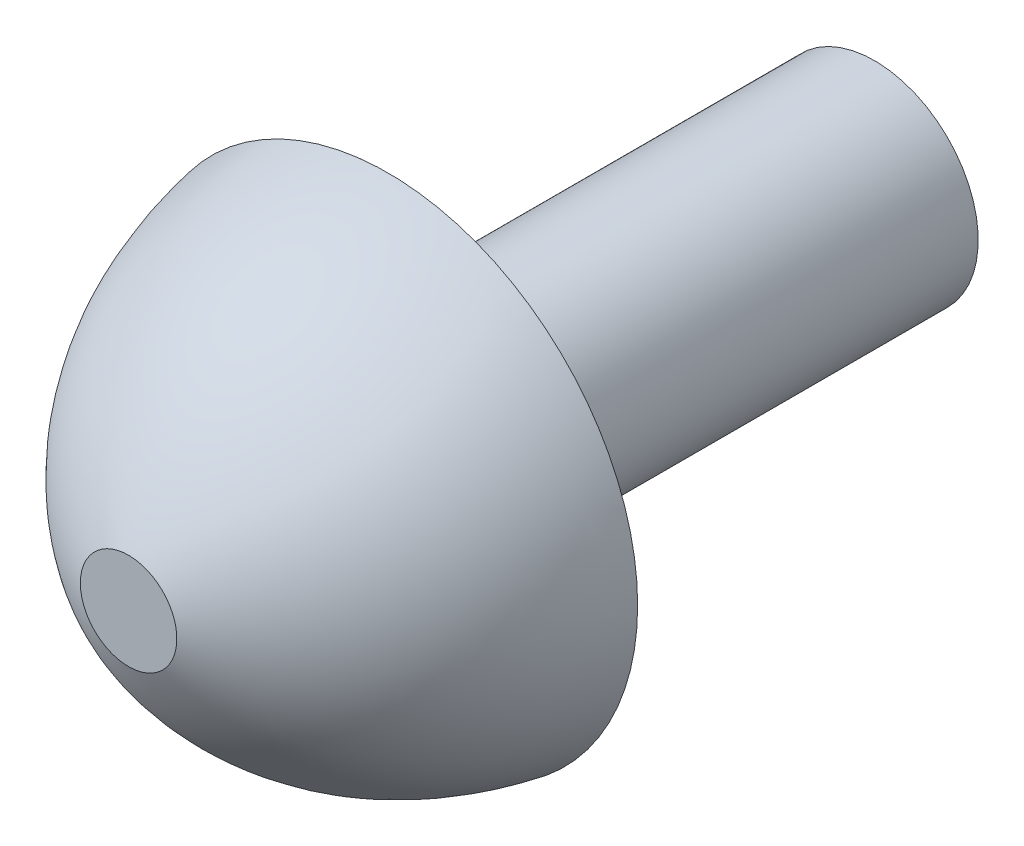
ISO-10303-21;
HEADER;
FILE_DESCRIPTION(('STEP AP214'),'2;1');
FILE_NAME('part.step','',(''),(''),'','','');
FILE_SCHEMA(('AUTOMOTIVE_DESIGN { 1 0 10303 214 1 1 1 1 }'));
ENDSEC;
DATA;
#1=APPLICATION_CONTEXT('core data for automotive mechanical design processes');
#2=APPLICATION_PROTOCOL_DEFINITION('international standard','automotive_design',2000,#1);
#3=PRODUCT_CONTEXT('',#1,'mechanical');
#4=PRODUCT('Part','Part','',(#3));
#5=PRODUCT_RELATED_PRODUCT_CATEGORY('part','',(#4));
#6=PRODUCT_DEFINITION_FORMATION('','',#4);
#7=PRODUCT_DEFINITION_CONTEXT('part definition',#1,'design');
#8=PRODUCT_DEFINITION('design','',#6,#7);
#9=PRODUCT_DEFINITION_SHAPE('','',#8);
#10=(LENGTH_UNIT() NAMED_UNIT(*) SI_UNIT(.MILLI.,.METRE.));
#11=(NAMED_UNIT(*) PLANE_ANGLE_UNIT() SI_UNIT($,.RADIAN.));
#12=(NAMED_UNIT(*) SI_UNIT($,.STERADIAN.) SOLID_ANGLE_UNIT());
#13=UNCERTAINTY_MEASURE_WITH_UNIT(LENGTH_MEASURE(1.E-05),#10,'distance_accuracy_value','');
#14=(GEOMETRIC_REPRESENTATION_CONTEXT(3) GLOBAL_UNCERTAINTY_ASSIGNED_CONTEXT((#13)) GLOBAL_UNIT_ASSIGNED_CONTEXT((#10,
#11,#12)) REPRESENTATION_CONTEXT('',''));
#15=CARTESIAN_POINT('',(0.,0.,0.));
#16=DIRECTION('',(0.,0.,1.));
#17=DIRECTION('',(1.,0.,0.));
#18=AXIS2_PLACEMENT_3D('',#15,#16,#17);
#19=CARTESIAN_POINT('',(0.,0.,-11.1962025316456));
#20=DIRECTION('',(0.,0.,-1.));
#21=DIRECTION('',(-1.,0.,0.));
#22=AXIS2_PLACEMENT_3D('',#19,#20,#21);
#23=PLANE('',#22);
#24=CARTESIAN_POINT('',(-4.33871671759057,0.,-11.1962025316456));
#25=DIRECTION('',(0.,0.,-1.));
#26=DIRECTION('',(-1.,0.,0.));
#27=AXIS2_PLACEMENT_3D('',#24,#25,#26);
#28=CIRCLE('',#27,3.19620253164557);
#29=CARTESIAN_POINT('',(-7.53491924923615,0.,-11.1962025316456));
#30=VERTEX_POINT('',#29);
#31=EDGE_CURVE('E47',#30,#30,#28,.T.);
#32=ORIENTED_EDGE('',*,*,#31,.T.);
#33=EDGE_LOOP('',(#32));
#34=FACE_BOUND('',#33,.T.);
#35=ADVANCED_FACE('F33',(#34),#23,.T.);
#36=CARTESIAN_POINT('',(0.,0.,11.8037974683544));
#37=DIRECTION('',(0.,0.,1.));
#38=DIRECTION('',(1.,0.,0.));
#39=AXIS2_PLACEMENT_3D('',#36,#37,#38);
#40=PLANE('',#39);
#41=CARTESIAN_POINT('',(-4.33871671759057,0.,11.8037974683544));
#42=DIRECTION('',(0.,0.,-1.));
#43=DIRECTION('',(-1.,0.,0.));
#44=AXIS2_PLACEMENT_3D('',#41,#42,#43);
#45=CIRCLE('',#44,1.48734177215188);
#46=CARTESIAN_POINT('',(-5.82605848974246,0.,11.8037974683544));
#47=VERTEX_POINT('',#46);
#48=EDGE_CURVE('E10',#47,#47,#45,.T.);
#49=ORIENTED_EDGE('',*,*,#48,.F.);
#50=EDGE_LOOP('',(#49));
#51=FACE_BOUND('',#50,.T.);
#52=ADVANCED_FACE('F63',(#51),#40,.T.);
#53=CARTESIAN_POINT('',(3.357485814055,0.,3.80379746835443));
#54=CARTESIAN_POINT('',(2.34396581801159,0.,9.41886461786171));
#55=CARTESIAN_POINT('',(-2.85137494543869,0.,11.8037974683544));
#56=B_SPLINE_CURVE_WITH_KNOTS('',2,(#53,#54,#55),.UNSPECIFIED.,.F.,.F.,(3,3),(0.,1.),.UNSPECIFIED.);
#57=CARTESIAN_POINT('',(-4.33871671759057,0.,-16.2974683544304));
#58=DIRECTION('',(0.,0.,-1.));
#59=AXIS1_PLACEMENT('',#57,#58);
#60=SURFACE_OF_REVOLUTION('',#56,#59);
#61=ORIENTED_EDGE('',*,*,#48,.T.);
#62=EDGE_LOOP('',(#61));
#63=FACE_BOUND('',#62,.T.);
#64=CARTESIAN_POINT('',(-4.33871671759057,0.,3.80379746835443));
#65=DIRECTION('',(0.,0.,-1.));
#66=DIRECTION('',(-1.,0.,0.));
#67=AXIS2_PLACEMENT_3D('',#64,#65,#66);
#68=CIRCLE('',#67,7.69620253164557);
#69=CARTESIAN_POINT('',(-12.0349192492361,0.,3.80379746835443));
#70=VERTEX_POINT('',#69);
#71=EDGE_CURVE('E39',#70,#70,#68,.T.);
#72=ORIENTED_EDGE('',*,*,#71,.F.);
#73=EDGE_LOOP('',(#72));
#74=FACE_BOUND('',#73,.T.);
#75=ADVANCED_FACE('F59',(#63,#74),#60,.F.);
#76=CARTESIAN_POINT('',(0.,0.,3.80379746835442));
#77=DIRECTION('',(0.,0.,-1.));
#78=DIRECTION('',(-1.,0.,0.));
#79=AXIS2_PLACEMENT_3D('',#76,#77,#78);
#80=PLANE('',#79);
#81=ORIENTED_EDGE('',*,*,#71,.T.);
#82=EDGE_LOOP('',(#81));
#83=FACE_BOUND('',#82,.T.);
#84=CARTESIAN_POINT('',(-4.33871671759057,0.,3.80379746835443));
#85=DIRECTION('',(0.,0.,-1.));
#86=DIRECTION('',(-1.,0.,0.));
#87=AXIS2_PLACEMENT_3D('',#84,#85,#86);
#88=CIRCLE('',#87,3.19620253164557);
#89=CARTESIAN_POINT('',(-7.53491924923615,0.,3.80379746835443));
#90=VERTEX_POINT('',#89);
#91=EDGE_CURVE('E43',#90,#90,#88,.T.);
#92=ORIENTED_EDGE('',*,*,#91,.F.);
#93=EDGE_LOOP('',(#92));
#94=FACE_BOUND('',#93,.T.);
#95=ADVANCED_FACE('F62',(#83,#94),#80,.T.);
#96=CARTESIAN_POINT('',(-4.33871671759057,0.,-16.2974683544304));
#97=DIRECTION('',(0.,0.,-1.));
#98=DIRECTION('',(-1.,0.,0.));
#99=AXIS2_PLACEMENT_3D('',#96,#97,#98);
#100=CYLINDRICAL_SURFACE('',#99,3.19620253164557);
#101=ORIENTED_EDGE('',*,*,#91,.T.);
#102=EDGE_LOOP('',(#101));
#103=FACE_BOUND('',#102,.T.);
#104=ORIENTED_EDGE('',*,*,#31,.F.);
#105=EDGE_LOOP('',(#104));
#106=FACE_BOUND('',#105,.T.);
#107=ADVANCED_FACE('F75',(#103,#106),#100,.T.);
#108=CLOSED_SHELL('',(#35,#52,#75,#95,#107));
#109=MANIFOLD_SOLID_BREP('B2',#108);
#110=ADVANCED_BREP_SHAPE_REPRESENTATION('',(#18,#109),#14);
#111=SHAPE_DEFINITION_REPRESENTATION(#9,#110);
ENDSEC;
END-ISO-10303-21;
